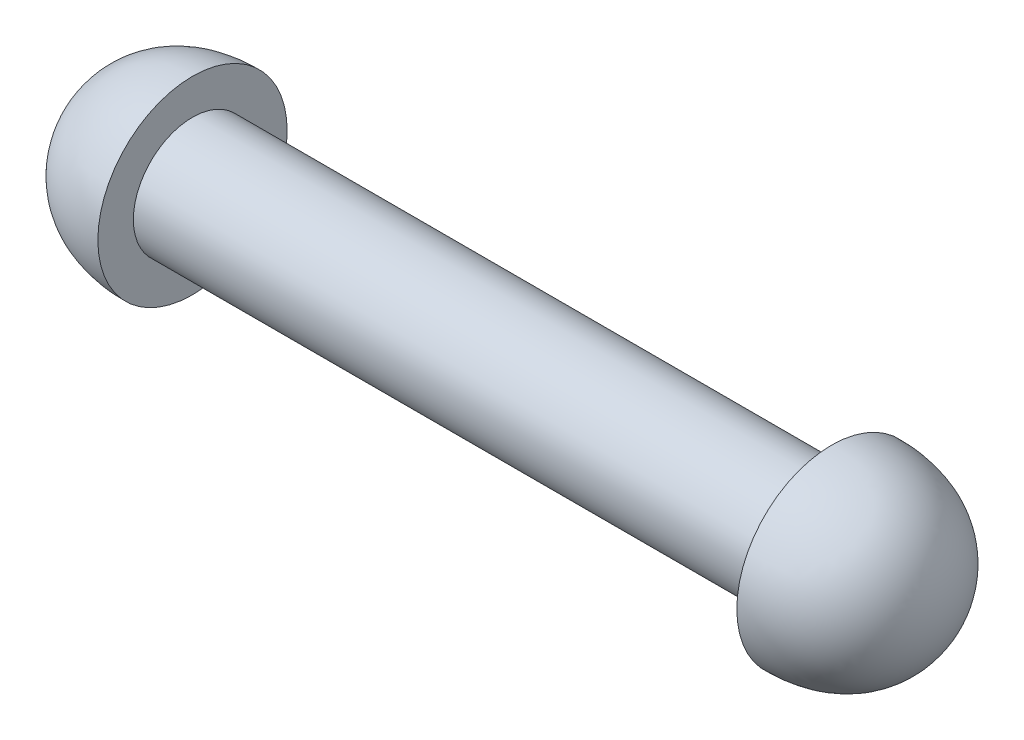
ISO-10303-21;
HEADER;
FILE_DESCRIPTION(('STEP AP214'),'2;1');
FILE_NAME('part.step','',(''),(''),'','','');
FILE_SCHEMA(('AUTOMOTIVE_DESIGN { 1 0 10303 214 1 1 1 1 }'));
ENDSEC;
DATA;
#1=APPLICATION_CONTEXT('core data for automotive mechanical design processes');
#2=APPLICATION_PROTOCOL_DEFINITION('international standard','automotive_design',2000,#1);
#3=PRODUCT_CONTEXT('',#1,'mechanical');
#4=PRODUCT('Part','Part','',(#3));
#5=PRODUCT_RELATED_PRODUCT_CATEGORY('part','',(#4));
#6=PRODUCT_DEFINITION_FORMATION('','',#4);
#7=PRODUCT_DEFINITION_CONTEXT('part definition',#1,'design');
#8=PRODUCT_DEFINITION('design','',#6,#7);
#9=PRODUCT_DEFINITION_SHAPE('','',#8);
#10=(LENGTH_UNIT() NAMED_UNIT(*) SI_UNIT(.MILLI.,.METRE.));
#11=(NAMED_UNIT(*) PLANE_ANGLE_UNIT() SI_UNIT($,.RADIAN.));
#12=(NAMED_UNIT(*) SI_UNIT($,.STERADIAN.) SOLID_ANGLE_UNIT());
#13=UNCERTAINTY_MEASURE_WITH_UNIT(LENGTH_MEASURE(1.E-05),#10,'distance_accuracy_value','');
#14=(GEOMETRIC_REPRESENTATION_CONTEXT(3) GLOBAL_UNCERTAINTY_ASSIGNED_CONTEXT((#13)) GLOBAL_UNIT_ASSIGNED_CONTEXT((#10,
#11,#12)) REPRESENTATION_CONTEXT('',''));
#15=CARTESIAN_POINT('',(0.,0.,0.));
#16=DIRECTION('',(0.,0.,1.));
#17=DIRECTION('',(1.,0.,0.));
#18=AXIS2_PLACEMENT_3D('',#15,#16,#17);
#19=CARTESIAN_POINT('',(135.,0.,0.));
#20=DIRECTION('',(-1.,0.,0.));
#21=DIRECTION('',(0.,0.,1.));
#22=AXIS2_PLACEMENT_3D('',#19,#20,#21);
#23=CYLINDRICAL_SURFACE('',#22,25.);
#24=CARTESIAN_POINT('',(0.,0.,0.));
#25=DIRECTION('',(-1.,0.,0.));
#26=DIRECTION('',(0.,0.,1.));
#27=AXIS2_PLACEMENT_3D('',#24,#25,#26);
#28=CIRCLE('',#27,25.);
#29=CARTESIAN_POINT('',(0.,0.,25.));
#30=VERTEX_POINT('',#29);
#31=EDGE_CURVE('E11',#30,#30,#28,.T.);
#32=ORIENTED_EDGE('',*,*,#31,.F.);
#33=EDGE_LOOP('',(#32));
#34=FACE_BOUND('',#33,.T.);
#35=CARTESIAN_POINT('',(270.,0.,0.));
#36=DIRECTION('',(1.,0.,0.));
#37=DIRECTION('',(0.,0.,-1.));
#38=AXIS2_PLACEMENT_3D('',#35,#36,#37);
#39=CIRCLE('',#38,25.);
#40=CARTESIAN_POINT('',(270.,0.,-25.));
#41=VERTEX_POINT('',#40);
#42=EDGE_CURVE('E57',#41,#41,#39,.T.);
#43=ORIENTED_EDGE('',*,*,#42,.F.);
#44=EDGE_LOOP('',(#43));
#45=FACE_BOUND('',#44,.T.);
#46=ADVANCED_FACE('F34',(#34,#45),#23,.T.);
#47=CARTESIAN_POINT('',(0.,40.,0.));
#48=CARTESIAN_POINT('',(-30.9912388312532,40.,0.));
#49=CARTESIAN_POINT('',(-45.4583925127281,20.1837818553006,0.));
#50=CARTESIAN_POINT('',(-45.4583925127281,0.,0.));
#51=B_SPLINE_CURVE_WITH_KNOTS('',3,(#47,#48,#49,#50),.UNSPECIFIED.,.F.,.F.,(4,4),(0.,1.),.UNSPECIFIED.);
#52=CARTESIAN_POINT('',(-100.078673333577,0.,0.));
#53=DIRECTION('',(-1.,0.,0.));
#54=AXIS1_PLACEMENT('',#52,#53);
#55=SURFACE_OF_REVOLUTION('',#51,#54);
#56=CARTESIAN_POINT('',(-45.4583925127281,0.,0.));
#57=VERTEX_POINT('',#56);
#58=VERTEX_LOOP('',#57);
#59=FACE_BOUND('',#58,.T.);
#60=CARTESIAN_POINT('',(0.,0.,0.));
#61=DIRECTION('',(-1.,0.,0.));
#62=DIRECTION('',(0.,0.,1.));
#63=AXIS2_PLACEMENT_3D('',#60,#61,#62);
#64=CIRCLE('',#63,40.);
#65=CARTESIAN_POINT('',(0.,0.,40.));
#66=VERTEX_POINT('',#65);
#67=EDGE_CURVE('E41',#66,#66,#64,.T.);
#68=ORIENTED_EDGE('',*,*,#67,.T.);
#69=EDGE_LOOP('',(#68));
#70=FACE_BOUND('',#69,.T.);
#71=ADVANCED_FACE('F72',(#59,#70),#55,.T.);
#72=CARTESIAN_POINT('',(0.,40.,0.));
#73=DIRECTION('',(-1.,0.,0.));
#74=DIRECTION('',(0.,0.,1.));
#75=AXIS2_PLACEMENT_3D('',#72,#73,#74);
#76=PLANE('',#75);
#77=ORIENTED_EDGE('',*,*,#31,.T.);
#78=EDGE_LOOP('',(#77));
#79=FACE_BOUND('',#78,.T.);
#80=ORIENTED_EDGE('',*,*,#67,.F.);
#81=EDGE_LOOP('',(#80));
#82=FACE_BOUND('',#81,.T.);
#83=ADVANCED_FACE('F51',(#79,#82),#76,.F.);
#84=CARTESIAN_POINT('',(270.,40.,0.));
#85=CARTESIAN_POINT('',(300.991238831253,40.,0.));
#86=CARTESIAN_POINT('',(315.458392512728,20.1837818553006,0.));
#87=CARTESIAN_POINT('',(315.458392512728,0.,0.));
#88=B_SPLINE_CURVE_WITH_KNOTS('',3,(#84,#85,#86,#87),.UNSPECIFIED.,.F.,.F.,(4,4),(0.,1.),.UNSPECIFIED.);
#89=CARTESIAN_POINT('',(370.078673333577,0.,0.));
#90=DIRECTION('',(1.,0.,0.));
#91=AXIS1_PLACEMENT('',#89,#90);
#92=SURFACE_OF_REVOLUTION('',#88,#91);
#93=CARTESIAN_POINT('',(315.458392512728,0.,0.));
#94=VERTEX_POINT('',#93);
#95=VERTEX_LOOP('',#94);
#96=FACE_BOUND('',#95,.T.);
#97=CARTESIAN_POINT('',(270.,0.,0.));
#98=DIRECTION('',(-1.,0.,0.));
#99=DIRECTION('',(0.,0.,1.));
#100=AXIS2_PLACEMENT_3D('',#97,#98,#99);
#101=CIRCLE('',#100,40.);
#102=CARTESIAN_POINT('',(270.,0.,40.));
#103=VERTEX_POINT('',#102);
#104=EDGE_CURVE('E55',#103,#103,#101,.T.);
#105=ORIENTED_EDGE('',*,*,#104,.F.);
#106=EDGE_LOOP('',(#105));
#107=FACE_BOUND('',#106,.T.);
#108=ADVANCED_FACE('F47',(#96,#107),#92,.T.);
#109=CARTESIAN_POINT('',(270.,40.,0.));
#110=DIRECTION('',(1.,0.,0.));
#111=DIRECTION('',(0.,0.,1.));
#112=AXIS2_PLACEMENT_3D('',#109,#110,#111);
#113=PLANE('',#112);
#114=ORIENTED_EDGE('',*,*,#42,.T.);
#115=EDGE_LOOP('',(#114));
#116=FACE_BOUND('',#115,.T.);
#117=ORIENTED_EDGE('',*,*,#104,.T.);
#118=EDGE_LOOP('',(#117));
#119=FACE_BOUND('',#118,.T.);
#120=ADVANCED_FACE('F50',(#116,#119),#113,.F.);
#121=CLOSED_SHELL('',(#46,#71,#83,#108,#120));
#122=MANIFOLD_SOLID_BREP('B2',#121);
#123=ADVANCED_BREP_SHAPE_REPRESENTATION('',(#18,#122),#14);
#124=SHAPE_DEFINITION_REPRESENTATION(#9,#123);
ENDSEC;
END-ISO-10303-21;
